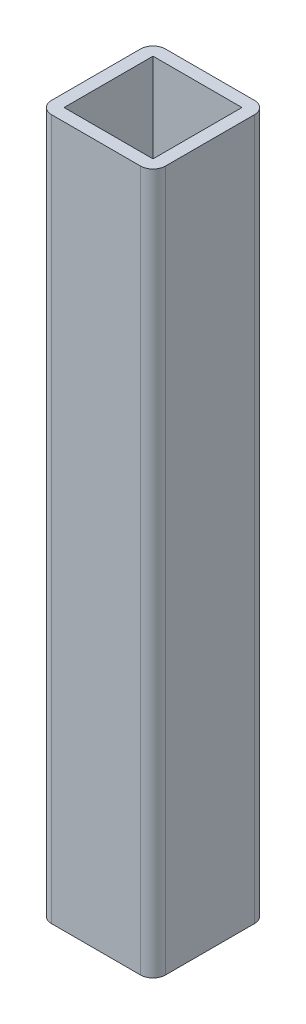
ISO-10303-21;
HEADER;
FILE_DESCRIPTION(('STEP AP214'),'2;1');
FILE_NAME('part.step','',(''),(''),'','','');
FILE_SCHEMA(('AUTOMOTIVE_DESIGN { 1 0 10303 214 1 1 1 1 }'));
ENDSEC;
DATA;
#1=APPLICATION_CONTEXT('core data for automotive mechanical design processes');
#2=APPLICATION_PROTOCOL_DEFINITION('international standard','automotive_design',2000,#1);
#3=PRODUCT_CONTEXT('',#1,'mechanical');
#4=PRODUCT('Part','Part','',(#3));
#5=PRODUCT_RELATED_PRODUCT_CATEGORY('part','',(#4));
#6=PRODUCT_DEFINITION_FORMATION('','',#4);
#7=PRODUCT_DEFINITION_CONTEXT('part definition',#1,'design');
#8=PRODUCT_DEFINITION('design','',#6,#7);
#9=PRODUCT_DEFINITION_SHAPE('','',#8);
#10=(LENGTH_UNIT() NAMED_UNIT(*) SI_UNIT(.MILLI.,.METRE.));
#11=(NAMED_UNIT(*) PLANE_ANGLE_UNIT() SI_UNIT($,.RADIAN.));
#12=(NAMED_UNIT(*) SI_UNIT($,.STERADIAN.) SOLID_ANGLE_UNIT());
#13=UNCERTAINTY_MEASURE_WITH_UNIT(LENGTH_MEASURE(1.E-05),#10,'distance_accuracy_value','');
#14=(GEOMETRIC_REPRESENTATION_CONTEXT(3) GLOBAL_UNCERTAINTY_ASSIGNED_CONTEXT((#13)) GLOBAL_UNIT_ASSIGNED_CONTEXT((#10,
#11,#12)) REPRESENTATION_CONTEXT('',''));
#15=CARTESIAN_POINT('',(0.,0.,0.));
#16=DIRECTION('',(0.,0.,1.));
#17=DIRECTION('',(1.,0.,0.));
#18=AXIS2_PLACEMENT_3D('',#15,#16,#17);
#19=CARTESIAN_POINT('',(22.8,157.52,2.8));
#20=DIRECTION('',(0.,-1.,0.));
#21=DIRECTION('',(0.,0.,-1.));
#22=AXIS2_PLACEMENT_3D('',#19,#20,#21);
#23=CYLINDRICAL_SURFACE('',#22,2.8);
#24=CARTESIAN_POINT('',(22.8,0.,2.8));
#25=DIRECTION('',(0.,1.,0.));
#26=DIRECTION('',(0.,0.,-1.));
#27=AXIS2_PLACEMENT_3D('',#24,#25,#26);
#28=CIRCLE('',#27,2.8);
#29=CARTESIAN_POINT('',(25.6,0.,2.80000000000002));
#30=VERTEX_POINT('',#29);
#31=CARTESIAN_POINT('',(22.8,0.,0.));
#32=VERTEX_POINT('',#31);
#33=EDGE_CURVE('E160',#30,#32,#28,.T.);
#34=ORIENTED_EDGE('',*,*,#33,.T.);
#35=DIRECTION('',(0.,-1.,0.));
#36=VECTOR('',#35,1.);
#37=CARTESIAN_POINT('',(22.8,157.52,0.));
#38=LINE('',#37,#36);
#39=CARTESIAN_POINT('',(22.8,157.52,0.));
#40=VERTEX_POINT('',#39);
#41=EDGE_CURVE('E11',#40,#32,#38,.T.);
#42=ORIENTED_EDGE('',*,*,#41,.F.);
#43=CARTESIAN_POINT('',(22.8,157.52,2.8));
#44=DIRECTION('',(0.,1.,0.));
#45=DIRECTION('',(0.,0.,-1.));
#46=AXIS2_PLACEMENT_3D('',#43,#44,#45);
#47=CIRCLE('',#46,2.8);
#48=CARTESIAN_POINT('',(25.6,157.52,2.80000000000002));
#49=VERTEX_POINT('',#48);
#50=EDGE_CURVE('E161',#49,#40,#47,.T.);
#51=ORIENTED_EDGE('',*,*,#50,.F.);
#52=DIRECTION('',(0.,-1.,0.));
#53=VECTOR('',#52,1.);
#54=CARTESIAN_POINT('',(25.6,157.52,2.80000000000002));
#55=LINE('',#54,#53);
#56=EDGE_CURVE('E179',#49,#30,#55,.T.);
#57=ORIENTED_EDGE('',*,*,#56,.T.);
#58=EDGE_LOOP('',(#34,#42,#51,#57));
#59=FACE_BOUND('',#58,.T.);
#60=ADVANCED_FACE('F35',(#59),#23,.T.);
#61=CARTESIAN_POINT('',(2.80000000000002,157.52,0.));
#62=DIRECTION('',(0.,0.,1.));
#63=DIRECTION('',(1.,0.,0.));
#64=AXIS2_PLACEMENT_3D('',#61,#62,#63);
#65=PLANE('',#64);
#66=DIRECTION('',(-1.,0.,0.));
#67=VECTOR('',#66,1.);
#68=CARTESIAN_POINT('',(2.80000000000002,0.,0.));
#69=LINE('',#68,#67);
#70=CARTESIAN_POINT('',(2.80000000000002,0.,0.));
#71=VERTEX_POINT('',#70);
#72=EDGE_CURVE('E182',#32,#71,#69,.T.);
#73=ORIENTED_EDGE('',*,*,#72,.T.);
#74=DIRECTION('',(0.,-1.,0.));
#75=VECTOR('',#74,1.);
#76=CARTESIAN_POINT('',(2.80000000000002,157.52,0.));
#77=LINE('',#76,#75);
#78=CARTESIAN_POINT('',(2.80000000000002,157.52,0.));
#79=VERTEX_POINT('',#78);
#80=EDGE_CURVE('E42',#79,#71,#77,.T.);
#81=ORIENTED_EDGE('',*,*,#80,.F.);
#82=DIRECTION('',(-1.,0.,0.));
#83=VECTOR('',#82,1.);
#84=CARTESIAN_POINT('',(2.80000000000002,157.52,0.));
#85=LINE('',#84,#83);
#86=EDGE_CURVE('E164',#40,#79,#85,.T.);
#87=ORIENTED_EDGE('',*,*,#86,.F.);
#88=ORIENTED_EDGE('',*,*,#41,.T.);
#89=EDGE_LOOP('',(#73,#81,#87,#88));
#90=FACE_BOUND('',#89,.T.);
#91=ADVANCED_FACE('F237',(#90),#65,.F.);
#92=CARTESIAN_POINT('',(2.8,157.52,2.8));
#93=DIRECTION('',(0.,-1.,0.));
#94=DIRECTION('',(0.,0.,-1.));
#95=AXIS2_PLACEMENT_3D('',#92,#93,#94);
#96=CYLINDRICAL_SURFACE('',#95,2.8);
#97=CARTESIAN_POINT('',(2.8,0.,2.8));
#98=DIRECTION('',(0.,1.,0.));
#99=DIRECTION('',(0.,0.,1.));
#100=AXIS2_PLACEMENT_3D('',#97,#98,#99);
#101=CIRCLE('',#100,2.8);
#102=CARTESIAN_POINT('',(0.,0.,2.80000000000002));
#103=VERTEX_POINT('',#102);
#104=EDGE_CURVE('E184',#71,#103,#101,.T.);
#105=ORIENTED_EDGE('',*,*,#104,.T.);
#106=DIRECTION('',(0.,-1.,0.));
#107=VECTOR('',#106,1.);
#108=CARTESIAN_POINT('',(0.,157.52,2.80000000000002));
#109=LINE('',#108,#107);
#110=CARTESIAN_POINT('',(0.,157.52,2.80000000000002));
#111=VERTEX_POINT('',#110);
#112=EDGE_CURVE('E209',#111,#103,#109,.T.);
#113=ORIENTED_EDGE('',*,*,#112,.F.);
#114=CARTESIAN_POINT('',(2.8,157.52,2.8));
#115=DIRECTION('',(0.,1.,0.));
#116=DIRECTION('',(0.,0.,1.));
#117=AXIS2_PLACEMENT_3D('',#114,#115,#116);
#118=CIRCLE('',#117,2.8);
#119=EDGE_CURVE('E167',#79,#111,#118,.T.);
#120=ORIENTED_EDGE('',*,*,#119,.F.);
#121=ORIENTED_EDGE('',*,*,#80,.T.);
#122=EDGE_LOOP('',(#105,#113,#120,#121));
#123=FACE_BOUND('',#122,.T.);
#124=ADVANCED_FACE('F216',(#123),#96,.T.);
#125=CARTESIAN_POINT('',(0.,157.52,2.80000000000002));
#126=DIRECTION('',(1.,0.,0.));
#127=DIRECTION('',(0.,0.,-1.));
#128=AXIS2_PLACEMENT_3D('',#125,#126,#127);
#129=PLANE('',#128);
#130=DIRECTION('',(0.,0.,1.));
#131=VECTOR('',#130,1.);
#132=CARTESIAN_POINT('',(0.,0.,2.80000000000002));
#133=LINE('',#132,#131);
#134=CARTESIAN_POINT('',(0.,0.,22.8));
#135=VERTEX_POINT('',#134);
#136=EDGE_CURVE('E186',#103,#135,#133,.T.);
#137=ORIENTED_EDGE('',*,*,#136,.T.);
#138=DIRECTION('',(0.,-1.,0.));
#139=VECTOR('',#138,1.);
#140=CARTESIAN_POINT('',(0.,157.52,22.8));
#141=LINE('',#140,#139);
#142=CARTESIAN_POINT('',(0.,157.52,22.8));
#143=VERTEX_POINT('',#142);
#144=EDGE_CURVE('E206',#143,#135,#141,.T.);
#145=ORIENTED_EDGE('',*,*,#144,.F.);
#146=DIRECTION('',(0.,0.,1.));
#147=VECTOR('',#146,1.);
#148=CARTESIAN_POINT('',(0.,157.52,2.80000000000002));
#149=LINE('',#148,#147);
#150=EDGE_CURVE('E169',#111,#143,#149,.T.);
#151=ORIENTED_EDGE('',*,*,#150,.F.);
#152=ORIENTED_EDGE('',*,*,#112,.T.);
#153=EDGE_LOOP('',(#137,#145,#151,#152));
#154=FACE_BOUND('',#153,.T.);
#155=ADVANCED_FACE('F225',(#154),#129,.F.);
#156=CARTESIAN_POINT('',(2.8,157.52,22.8));
#157=DIRECTION('',(0.,-1.,0.));
#158=DIRECTION('',(0.,0.,-1.));
#159=AXIS2_PLACEMENT_3D('',#156,#157,#158);
#160=CYLINDRICAL_SURFACE('',#159,2.8);
#161=CARTESIAN_POINT('',(2.8,0.,22.8));
#162=DIRECTION('',(0.,1.,0.));
#163=DIRECTION('',(0.,0.,1.));
#164=AXIS2_PLACEMENT_3D('',#161,#162,#163);
#165=CIRCLE('',#164,2.8);
#166=CARTESIAN_POINT('',(2.80000000000002,0.,25.6));
#167=VERTEX_POINT('',#166);
#168=EDGE_CURVE('E188',#135,#167,#165,.T.);
#169=ORIENTED_EDGE('',*,*,#168,.T.);
#170=DIRECTION('',(0.,-1.,0.));
#171=VECTOR('',#170,1.);
#172=CARTESIAN_POINT('',(2.80000000000002,157.52,25.6));
#173=LINE('',#172,#171);
#174=CARTESIAN_POINT('',(2.80000000000002,157.52,25.6));
#175=VERTEX_POINT('',#174);
#176=EDGE_CURVE('E203',#175,#167,#173,.T.);
#177=ORIENTED_EDGE('',*,*,#176,.F.);
#178=CARTESIAN_POINT('',(2.8,157.52,22.8));
#179=DIRECTION('',(0.,1.,0.));
#180=DIRECTION('',(0.,0.,1.));
#181=AXIS2_PLACEMENT_3D('',#178,#179,#180);
#182=CIRCLE('',#181,2.8);
#183=EDGE_CURVE('E171',#143,#175,#182,.T.);
#184=ORIENTED_EDGE('',*,*,#183,.F.);
#185=ORIENTED_EDGE('',*,*,#144,.T.);
#186=EDGE_LOOP('',(#169,#177,#184,#185));
#187=FACE_BOUND('',#186,.T.);
#188=ADVANCED_FACE('F229',(#187),#160,.T.);
#189=CARTESIAN_POINT('',(2.80000000000002,157.52,25.6));
#190=DIRECTION('',(0.,0.,-1.));
#191=DIRECTION('',(-1.,0.,0.));
#192=AXIS2_PLACEMENT_3D('',#189,#190,#191);
#193=PLANE('',#192);
#194=DIRECTION('',(1.,0.,0.));
#195=VECTOR('',#194,1.);
#196=CARTESIAN_POINT('',(2.80000000000002,0.,25.6));
#197=LINE('',#196,#195);
#198=CARTESIAN_POINT('',(22.8,0.,25.6));
#199=VERTEX_POINT('',#198);
#200=EDGE_CURVE('E190',#167,#199,#197,.T.);
#201=ORIENTED_EDGE('',*,*,#200,.T.);
#202=DIRECTION('',(0.,-1.,0.));
#203=VECTOR('',#202,1.);
#204=CARTESIAN_POINT('',(22.8,157.52,25.6));
#205=LINE('',#204,#203);
#206=CARTESIAN_POINT('',(22.8,157.52,25.6));
#207=VERTEX_POINT('',#206);
#208=EDGE_CURVE('E200',#207,#199,#205,.T.);
#209=ORIENTED_EDGE('',*,*,#208,.F.);
#210=DIRECTION('',(1.,0.,0.));
#211=VECTOR('',#210,1.);
#212=CARTESIAN_POINT('',(2.80000000000002,157.52,25.6));
#213=LINE('',#212,#211);
#214=EDGE_CURVE('E173',#175,#207,#213,.T.);
#215=ORIENTED_EDGE('',*,*,#214,.F.);
#216=ORIENTED_EDGE('',*,*,#176,.T.);
#217=EDGE_LOOP('',(#201,#209,#215,#216));
#218=FACE_BOUND('',#217,.T.);
#219=ADVANCED_FACE('F250',(#218),#193,.F.);
#220=CARTESIAN_POINT('',(22.8,157.52,22.8));
#221=DIRECTION('',(0.,-1.,0.));
#222=DIRECTION('',(0.,0.,-1.));
#223=AXIS2_PLACEMENT_3D('',#220,#221,#222);
#224=CYLINDRICAL_SURFACE('',#223,2.8);
#225=CARTESIAN_POINT('',(22.8,0.,22.8));
#226=DIRECTION('',(0.,1.,0.));
#227=DIRECTION('',(0.,0.,1.));
#228=AXIS2_PLACEMENT_3D('',#225,#226,#227);
#229=CIRCLE('',#228,2.8);
#230=CARTESIAN_POINT('',(25.6,0.,22.8));
#231=VERTEX_POINT('',#230);
#232=EDGE_CURVE('E192',#199,#231,#229,.T.);
#233=ORIENTED_EDGE('',*,*,#232,.T.);
#234=DIRECTION('',(0.,-1.,0.));
#235=VECTOR('',#234,1.);
#236=CARTESIAN_POINT('',(25.6,157.52,22.8));
#237=LINE('',#236,#235);
#238=CARTESIAN_POINT('',(25.6,157.52,22.8));
#239=VERTEX_POINT('',#238);
#240=EDGE_CURVE('E197',#239,#231,#237,.T.);
#241=ORIENTED_EDGE('',*,*,#240,.F.);
#242=CARTESIAN_POINT('',(22.8,157.52,22.8));
#243=DIRECTION('',(0.,1.,0.));
#244=DIRECTION('',(0.,0.,1.));
#245=AXIS2_PLACEMENT_3D('',#242,#243,#244);
#246=CIRCLE('',#245,2.8);
#247=EDGE_CURVE('E175',#207,#239,#246,.T.);
#248=ORIENTED_EDGE('',*,*,#247,.F.);
#249=ORIENTED_EDGE('',*,*,#208,.T.);
#250=EDGE_LOOP('',(#233,#241,#248,#249));
#251=FACE_BOUND('',#250,.T.);
#252=ADVANCED_FACE('F248',(#251),#224,.T.);
#253=CARTESIAN_POINT('',(25.6,157.52,2.80000000000002));
#254=DIRECTION('',(-1.,0.,0.));
#255=DIRECTION('',(0.,0.,1.));
#256=AXIS2_PLACEMENT_3D('',#253,#254,#255);
#257=PLANE('',#256);
#258=DIRECTION('',(0.,0.,-1.));
#259=VECTOR('',#258,1.);
#260=CARTESIAN_POINT('',(25.6,0.,2.80000000000002));
#261=LINE('',#260,#259);
#262=EDGE_CURVE('E165',#231,#30,#261,.T.);
#263=ORIENTED_EDGE('',*,*,#262,.T.);
#264=ORIENTED_EDGE('',*,*,#56,.F.);
#265=DIRECTION('',(0.,0.,-1.));
#266=VECTOR('',#265,1.);
#267=CARTESIAN_POINT('',(25.6,157.52,2.80000000000002));
#268=LINE('',#267,#266);
#269=EDGE_CURVE('E177',#239,#49,#268,.T.);
#270=ORIENTED_EDGE('',*,*,#269,.F.);
#271=ORIENTED_EDGE('',*,*,#240,.T.);
#272=EDGE_LOOP('',(#263,#264,#270,#271));
#273=FACE_BOUND('',#272,.T.);
#274=ADVANCED_FACE('F243',(#273),#257,.F.);
#275=CARTESIAN_POINT('',(22.8,157.52,2.8));
#276=DIRECTION('',(0.,-1.,0.));
#277=DIRECTION('',(0.,0.,-1.));
#278=AXIS2_PLACEMENT_3D('',#275,#276,#277);
#279=PLANE('',#278);
#280=DIRECTION('',(1.,0.,0.));
#281=VECTOR('',#280,1.);
#282=CARTESIAN_POINT('',(22.8,157.52,2.8));
#283=LINE('',#282,#281);
#284=CARTESIAN_POINT('',(2.8,157.52,2.8));
#285=VERTEX_POINT('',#284);
#286=CARTESIAN_POINT('',(22.8,157.52,2.8));
#287=VERTEX_POINT('',#286);
#288=EDGE_CURVE('E154',#285,#287,#283,.T.);
#289=ORIENTED_EDGE('',*,*,#288,.T.);
#290=DIRECTION('',(0.,0.,1.));
#291=VECTOR('',#290,1.);
#292=CARTESIAN_POINT('',(22.8,157.52,2.8));
#293=LINE('',#292,#291);
#294=CARTESIAN_POINT('',(22.8,157.52,22.8));
#295=VERTEX_POINT('',#294);
#296=EDGE_CURVE('E157',#287,#295,#293,.T.);
#297=ORIENTED_EDGE('',*,*,#296,.T.);
#298=DIRECTION('',(-1.,0.,0.));
#299=VECTOR('',#298,1.);
#300=CARTESIAN_POINT('',(22.8,157.52,22.8));
#301=LINE('',#300,#299);
#302=CARTESIAN_POINT('',(2.8,157.52,22.8));
#303=VERTEX_POINT('',#302);
#304=EDGE_CURVE('E149',#295,#303,#301,.T.);
#305=ORIENTED_EDGE('',*,*,#304,.T.);
#306=DIRECTION('',(0.,0.,-1.));
#307=VECTOR('',#306,1.);
#308=CARTESIAN_POINT('',(2.8,157.52,2.79999999999999));
#309=LINE('',#308,#307);
#310=EDGE_CURVE('E129',#303,#285,#309,.T.);
#311=ORIENTED_EDGE('',*,*,#310,.T.);
#312=EDGE_LOOP('',(#289,#297,#305,#311));
#313=FACE_BOUND('',#312,.T.);
#314=ORIENTED_EDGE('',*,*,#50,.T.);
#315=ORIENTED_EDGE('',*,*,#86,.T.);
#316=ORIENTED_EDGE('',*,*,#119,.T.);
#317=ORIENTED_EDGE('',*,*,#150,.T.);
#318=ORIENTED_EDGE('',*,*,#183,.T.);
#319=ORIENTED_EDGE('',*,*,#214,.T.);
#320=ORIENTED_EDGE('',*,*,#247,.T.);
#321=ORIENTED_EDGE('',*,*,#269,.T.);
#322=EDGE_LOOP('',(#314,#315,#316,#317,#318,#319,#320,#321));
#323=FACE_BOUND('',#322,.T.);
#324=ADVANCED_FACE('F233',(#313,#323),#279,.F.);
#325=CARTESIAN_POINT('',(22.8,0.,2.8));
#326=DIRECTION('',(0.,-1.,0.));
#327=DIRECTION('',(0.,0.,-1.));
#328=AXIS2_PLACEMENT_3D('',#325,#326,#327);
#329=PLANE('',#328);
#330=DIRECTION('',(0.,0.,1.));
#331=VECTOR('',#330,1.);
#332=CARTESIAN_POINT('',(22.8,0.,2.8));
#333=LINE('',#332,#331);
#334=CARTESIAN_POINT('',(22.8,0.,2.8));
#335=VERTEX_POINT('',#334);
#336=CARTESIAN_POINT('',(22.8,0.,22.8));
#337=VERTEX_POINT('',#336);
#338=EDGE_CURVE('E57',#335,#337,#333,.T.);
#339=ORIENTED_EDGE('',*,*,#338,.F.);
#340=DIRECTION('',(1.,0.,0.));
#341=VECTOR('',#340,1.);
#342=CARTESIAN_POINT('',(2.8,0.,2.8));
#343=LINE('',#342,#341);
#344=CARTESIAN_POINT('',(2.8,0.,2.8));
#345=VERTEX_POINT('',#344);
#346=EDGE_CURVE('E142',#345,#335,#343,.T.);
#347=ORIENTED_EDGE('',*,*,#346,.F.);
#348=DIRECTION('',(0.,0.,-1.));
#349=VECTOR('',#348,1.);
#350=CARTESIAN_POINT('',(2.8,0.,2.8));
#351=LINE('',#350,#349);
#352=CARTESIAN_POINT('',(2.8,0.,22.8));
#353=VERTEX_POINT('',#352);
#354=EDGE_CURVE('E126',#353,#345,#351,.T.);
#355=ORIENTED_EDGE('',*,*,#354,.F.);
#356=DIRECTION('',(-1.,0.,0.));
#357=VECTOR('',#356,1.);
#358=CARTESIAN_POINT('',(2.8,0.,22.8));
#359=LINE('',#358,#357);
#360=EDGE_CURVE('E135',#337,#353,#359,.T.);
#361=ORIENTED_EDGE('',*,*,#360,.F.);
#362=EDGE_LOOP('',(#339,#347,#355,#361));
#363=FACE_BOUND('',#362,.T.);
#364=ORIENTED_EDGE('',*,*,#33,.F.);
#365=ORIENTED_EDGE('',*,*,#262,.F.);
#366=ORIENTED_EDGE('',*,*,#232,.F.);
#367=ORIENTED_EDGE('',*,*,#200,.F.);
#368=ORIENTED_EDGE('',*,*,#168,.F.);
#369=ORIENTED_EDGE('',*,*,#136,.F.);
#370=ORIENTED_EDGE('',*,*,#104,.F.);
#371=ORIENTED_EDGE('',*,*,#72,.F.);
#372=EDGE_LOOP('',(#364,#365,#366,#367,#368,#369,#370,#371));
#373=FACE_BOUND('',#372,.T.);
#374=ADVANCED_FACE('F139',(#363,#373),#329,.T.);
#375=CARTESIAN_POINT('',(22.8,1040.5,2.8));
#376=DIRECTION('',(1.,0.,0.));
#377=DIRECTION('',(0.,0.,-1.));
#378=AXIS2_PLACEMENT_3D('',#375,#376,#377);
#379=PLANE('',#378);
#380=DIRECTION('',(0.,-1.,0.));
#381=VECTOR('',#380,1.);
#382=CARTESIAN_POINT('',(22.8,1040.5,2.8));
#383=LINE('',#382,#381);
#384=EDGE_CURVE('E147',#287,#335,#383,.T.);
#385=ORIENTED_EDGE('',*,*,#384,.T.);
#386=ORIENTED_EDGE('',*,*,#338,.T.);
#387=DIRECTION('',(0.,-1.,0.));
#388=VECTOR('',#387,1.);
#389=CARTESIAN_POINT('',(22.8,1040.5,22.8));
#390=LINE('',#389,#388);
#391=EDGE_CURVE('E132',#295,#337,#390,.T.);
#392=ORIENTED_EDGE('',*,*,#391,.F.);
#393=ORIENTED_EDGE('',*,*,#296,.F.);
#394=EDGE_LOOP('',(#385,#386,#392,#393));
#395=FACE_BOUND('',#394,.T.);
#396=ADVANCED_FACE('F313',(#395),#379,.F.);
#397=CARTESIAN_POINT('',(2.8,1040.5,2.8));
#398=DIRECTION('',(0.,0.,-1.));
#399=DIRECTION('',(-1.,0.,0.));
#400=AXIS2_PLACEMENT_3D('',#397,#398,#399);
#401=PLANE('',#400);
#402=DIRECTION('',(0.,-1.,0.));
#403=VECTOR('',#402,1.);
#404=CARTESIAN_POINT('',(2.8,1040.5,2.8));
#405=LINE('',#404,#403);
#406=EDGE_CURVE('E131',#285,#345,#405,.T.);
#407=ORIENTED_EDGE('',*,*,#406,.T.);
#408=ORIENTED_EDGE('',*,*,#346,.T.);
#409=ORIENTED_EDGE('',*,*,#384,.F.);
#410=ORIENTED_EDGE('',*,*,#288,.F.);
#411=EDGE_LOOP('',(#407,#408,#409,#410));
#412=FACE_BOUND('',#411,.T.);
#413=ADVANCED_FACE('F322',(#412),#401,.F.);
#414=CARTESIAN_POINT('',(2.8,1040.5,2.8));
#415=DIRECTION('',(-1.,0.,0.));
#416=DIRECTION('',(0.,0.,1.));
#417=AXIS2_PLACEMENT_3D('',#414,#415,#416);
#418=PLANE('',#417);
#419=DIRECTION('',(0.,-1.,0.));
#420=VECTOR('',#419,1.);
#421=CARTESIAN_POINT('',(2.8,1040.5,22.8));
#422=LINE('',#421,#420);
#423=EDGE_CURVE('E49',#303,#353,#422,.T.);
#424=ORIENTED_EDGE('',*,*,#423,.T.);
#425=ORIENTED_EDGE('',*,*,#354,.T.);
#426=ORIENTED_EDGE('',*,*,#406,.F.);
#427=ORIENTED_EDGE('',*,*,#310,.F.);
#428=EDGE_LOOP('',(#424,#425,#426,#427));
#429=FACE_BOUND('',#428,.T.);
#430=ADVANCED_FACE('F123',(#429),#418,.F.);
#431=CARTESIAN_POINT('',(2.8,1040.5,22.8));
#432=DIRECTION('',(0.,0.,1.));
#433=DIRECTION('',(1.,0.,0.));
#434=AXIS2_PLACEMENT_3D('',#431,#432,#433);
#435=PLANE('',#434);
#436=ORIENTED_EDGE('',*,*,#391,.T.);
#437=ORIENTED_EDGE('',*,*,#360,.T.);
#438=ORIENTED_EDGE('',*,*,#423,.F.);
#439=ORIENTED_EDGE('',*,*,#304,.F.);
#440=EDGE_LOOP('',(#436,#437,#438,#439));
#441=FACE_BOUND('',#440,.T.);
#442=ADVANCED_FACE('F136',(#441),#435,.F.);
#443=CLOSED_SHELL('',(#60,#91,#124,#155,#188,#219,#252,#274,#324,#374,#396,#413,#430,#442));
#444=MANIFOLD_SOLID_BREP('B2',#443);
#445=ADVANCED_BREP_SHAPE_REPRESENTATION('',(#18,#444),#14);
#446=SHAPE_DEFINITION_REPRESENTATION(#9,#445);
ENDSEC;
END-ISO-10303-21;
